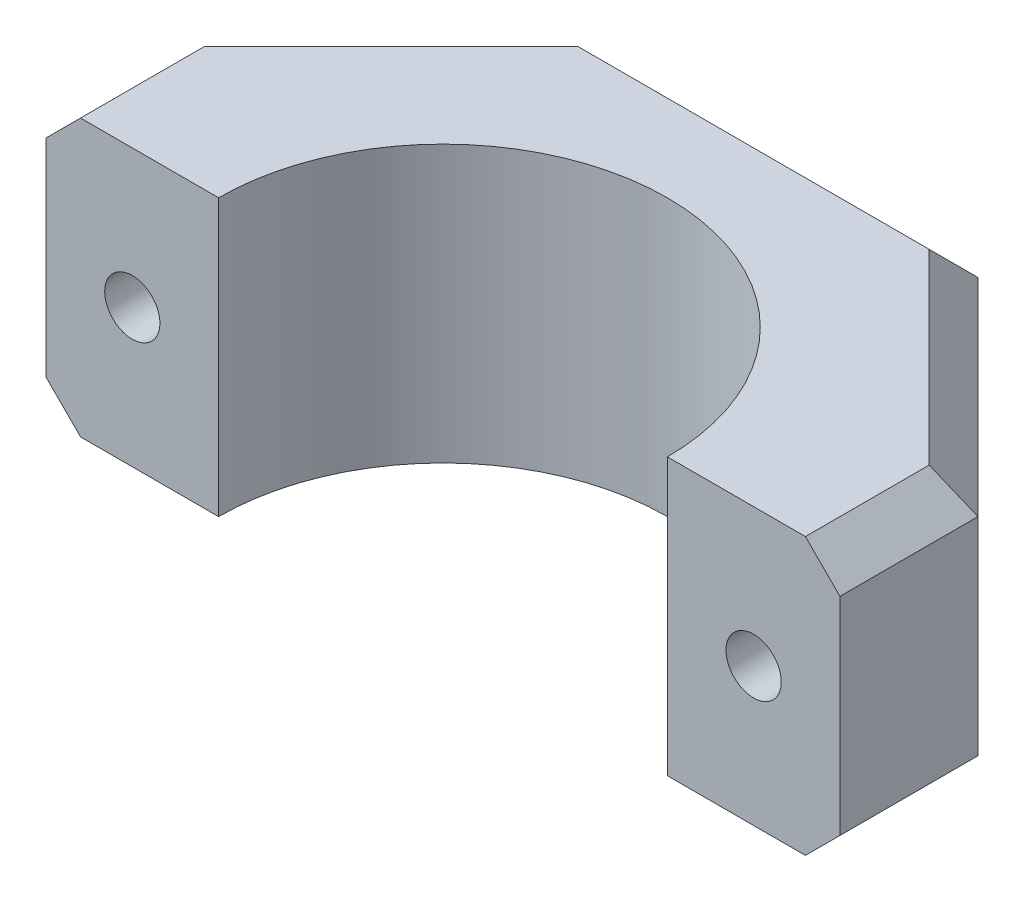
ISO-10303-21;
HEADER;
FILE_DESCRIPTION(('STEP AP214'),'2;1');
FILE_NAME('part.step','',(''),(''),'','','');
FILE_SCHEMA(('AUTOMOTIVE_DESIGN { 1 0 10303 214 1 1 1 1 }'));
ENDSEC;
DATA;
#1=APPLICATION_CONTEXT('core data for automotive mechanical design processes');
#2=APPLICATION_PROTOCOL_DEFINITION('international standard','automotive_design',2000,#1);
#3=PRODUCT_CONTEXT('',#1,'mechanical');
#4=PRODUCT('Part','Part','',(#3));
#5=PRODUCT_RELATED_PRODUCT_CATEGORY('part','',(#4));
#6=PRODUCT_DEFINITION_FORMATION('','',#4);
#7=PRODUCT_DEFINITION_CONTEXT('part definition',#1,'design');
#8=PRODUCT_DEFINITION('design','',#6,#7);
#9=PRODUCT_DEFINITION_SHAPE('','',#8);
#10=(LENGTH_UNIT() NAMED_UNIT(*) SI_UNIT(.MILLI.,.METRE.));
#11=(NAMED_UNIT(*) PLANE_ANGLE_UNIT() SI_UNIT($,.RADIAN.));
#12=(NAMED_UNIT(*) SI_UNIT($,.STERADIAN.) SOLID_ANGLE_UNIT());
#13=UNCERTAINTY_MEASURE_WITH_UNIT(LENGTH_MEASURE(1.E-05),#10,'distance_accuracy_value','');
#14=(GEOMETRIC_REPRESENTATION_CONTEXT(3) GLOBAL_UNCERTAINTY_ASSIGNED_CONTEXT((#13)) GLOBAL_UNIT_ASSIGNED_CONTEXT((#10,
#11,#12)) REPRESENTATION_CONTEXT('',''));
#15=CARTESIAN_POINT('',(0.,0.,0.));
#16=DIRECTION('',(0.,0.,1.));
#17=DIRECTION('',(1.,0.,0.));
#18=AXIS2_PLACEMENT_3D('',#15,#16,#17);
#19=CARTESIAN_POINT('',(-39.485549132948,8.,6.55438513369794));
#20=DIRECTION('',(0.,0.,-1.));
#21=DIRECTION('',(-1.,0.,0.));
#22=AXIS2_PLACEMENT_3D('',#19,#20,#21);
#23=CYLINDRICAL_SURFACE('',#22,1.6);
#24=CARTESIAN_POINT('',(-39.485549132948,8.,2.02890173410404));
#25=DIRECTION('',(0.,0.,-1.));
#26=DIRECTION('',(-1.,0.,0.));
#27=AXIS2_PLACEMENT_3D('',#24,#25,#26);
#28=CIRCLE('',#27,1.6);
#29=CARTESIAN_POINT('',(-41.085549132948,8.,2.02890173410404));
#30=VERTEX_POINT('',#29);
#31=EDGE_CURVE('E274',#30,#30,#28,.F.);
#32=CARTESIAN_POINT('',(-39.485549132948,8.,-1.97109826589596));
#33=DIRECTION('',(0.,0.,-1.));
#34=DIRECTION('',(-1.,0.,0.));
#35=AXIS2_PLACEMENT_3D('',#32,#33,#34);
#36=CIRCLE('',#35,1.6);
#37=CARTESIAN_POINT('',(-41.085549132948,8.,-1.97109826589596));
#38=VERTEX_POINT('',#37);
#39=EDGE_CURVE('E191',#38,#38,#36,.F.);
#40=CARTESIAN_POINT('',(-41.085549132948,8.,2.02890173410404));
#41=CARTESIAN_POINT('',(-41.085549132948,8.,1.98723506743738));
#42=CARTESIAN_POINT('',(-41.085549132948,8.,1.94556840077071));
#43=CARTESIAN_POINT('',(-41.085549132948,8.,1.86223506743738));
#44=CARTESIAN_POINT('',(-41.085549132948,8.,1.82056840077071));
#45=CARTESIAN_POINT('',(-41.085549132948,8.,1.73723506743738));
#46=CARTESIAN_POINT('',(-41.085549132948,8.,1.69556840077071));
#47=CARTESIAN_POINT('',(-41.085549132948,8.,1.61223506743737));
#48=CARTESIAN_POINT('',(-41.085549132948,8.,1.57056840077071));
#49=CARTESIAN_POINT('',(-41.085549132948,8.,1.48723506743738));
#50=CARTESIAN_POINT('',(-41.085549132948,8.,1.44556840077071));
#51=CARTESIAN_POINT('',(-41.085549132948,8.,1.36223506743738));
#52=CARTESIAN_POINT('',(-41.085549132948,8.,1.32056840077071));
#53=CARTESIAN_POINT('',(-41.085549132948,8.,1.23723506743738));
#54=CARTESIAN_POINT('',(-41.085549132948,8.,1.19556840077071));
#55=CARTESIAN_POINT('',(-41.085549132948,8.,1.11223506743738));
#56=CARTESIAN_POINT('',(-41.085549132948,8.,1.07056840077071));
#57=CARTESIAN_POINT('',(-41.085549132948,8.,0.987235067437375));
#58=CARTESIAN_POINT('',(-41.085549132948,8.,0.945568400770709));
#59=CARTESIAN_POINT('',(-41.085549132948,8.,0.862235067437375));
#60=CARTESIAN_POINT('',(-41.085549132948,8.,0.820568400770708));
#61=CARTESIAN_POINT('',(-41.085549132948,8.,0.737235067437375));
#62=CARTESIAN_POINT('',(-41.085549132948,8.,0.695568400770709));
#63=CARTESIAN_POINT('',(-41.085549132948,8.,0.612235067437376));
#64=CARTESIAN_POINT('',(-41.085549132948,8.,0.570568400770709));
#65=CARTESIAN_POINT('',(-41.085549132948,8.,0.487235067437376));
#66=CARTESIAN_POINT('',(-41.085549132948,8.,0.445568400770709));
#67=CARTESIAN_POINT('',(-41.085549132948,8.,0.362235067437376));
#68=CARTESIAN_POINT('',(-41.085549132948,8.,0.320568400770709));
#69=CARTESIAN_POINT('',(-41.085549132948,8.,0.237235067437375));
#70=CARTESIAN_POINT('',(-41.085549132948,8.,0.195568400770709));
#71=CARTESIAN_POINT('',(-41.085549132948,8.,0.112235067437375));
#72=CARTESIAN_POINT('',(-41.085549132948,8.,0.0705684007707086));
#73=CARTESIAN_POINT('',(-41.085549132948,8.,-0.0127649325626248));
#74=CARTESIAN_POINT('',(-41.085549132948,8.,-0.0544315992292915));
#75=CARTESIAN_POINT('',(-41.085549132948,8.,-0.137764932562625));
#76=CARTESIAN_POINT('',(-41.085549132948,8.,-0.179431599229292));
#77=CARTESIAN_POINT('',(-41.085549132948,8.,-0.262764932562625));
#78=CARTESIAN_POINT('',(-41.085549132948,8.,-0.304431599229292));
#79=CARTESIAN_POINT('',(-41.085549132948,8.,-0.387764932562625));
#80=CARTESIAN_POINT('',(-41.085549132948,8.,-0.429431599229292));
#81=CARTESIAN_POINT('',(-41.085549132948,8.,-0.512764932562625));
#82=CARTESIAN_POINT('',(-41.085549132948,8.,-0.554431599229292));
#83=CARTESIAN_POINT('',(-41.085549132948,8.,-0.637764932562625));
#84=CARTESIAN_POINT('',(-41.085549132948,8.,-0.679431599229292));
#85=CARTESIAN_POINT('',(-41.085549132948,8.,-0.762764932562625));
#86=CARTESIAN_POINT('',(-41.085549132948,8.,-0.804431599229291));
#87=CARTESIAN_POINT('',(-41.085549132948,8.,-0.887764932562625));
#88=CARTESIAN_POINT('',(-41.085549132948,8.,-0.929431599229291));
#89=CARTESIAN_POINT('',(-41.085549132948,8.,-1.01276493256262));
#90=CARTESIAN_POINT('',(-41.085549132948,8.,-1.05443159922929));
#91=CARTESIAN_POINT('',(-41.085549132948,8.,-1.13776493256262));
#92=CARTESIAN_POINT('',(-41.085549132948,8.,-1.17943159922929));
#93=CARTESIAN_POINT('',(-41.085549132948,8.,-1.26276493256262));
#94=CARTESIAN_POINT('',(-41.085549132948,8.,-1.30443159922929));
#95=CARTESIAN_POINT('',(-41.085549132948,8.,-1.38776493256262));
#96=CARTESIAN_POINT('',(-41.085549132948,8.,-1.42943159922929));
#97=CARTESIAN_POINT('',(-41.085549132948,8.,-1.51276493256262));
#98=CARTESIAN_POINT('',(-41.085549132948,8.,-1.55443159922929));
#99=CARTESIAN_POINT('',(-41.085549132948,8.,-1.63776493256262));
#100=CARTESIAN_POINT('',(-41.085549132948,8.,-1.67943159922929));
#101=CARTESIAN_POINT('',(-41.085549132948,8.,-1.76276493256262));
#102=CARTESIAN_POINT('',(-41.085549132948,8.,-1.80443159922929));
#103=CARTESIAN_POINT('',(-41.085549132948,8.,-1.88776493256262));
#104=CARTESIAN_POINT('',(-41.085549132948,8.,-1.92943159922929));
#105=CARTESIAN_POINT('',(-41.085549132948,8.,-1.97109826589596));
#106=B_SPLINE_CURVE_WITH_KNOTS('',3,(#40,#41,#42,#43,#44,#45,#46,#47,#48,#49,#50,#51,#52,#53,
#54,#55,#56,#57,#58,#59,#60,#61,#62,#63,#64,#65,#66,#67,#68,#69,#70,#71,#72,#73,#74,#75,#76,#77,
#78,#79,#80,#81,#82,#83,#84,#85,#86,#87,#88,#89,#90,#91,#92,#93,#94,#95,#96,#97,#98,#99,#100,
#101,#102,#103,#104,#105),.UNSPECIFIED.,.F.,.F.,(4,2,2,2,2,2,2,2,2,2,2,2,2,2,2,2,2,2,2,2,2,2,2,
2,2,2,2,2,2,2,2,2,4),(0.,0.125,0.25,0.375,0.5,0.625,0.75,0.875,1.,1.125,1.25,1.375,1.5,1.625,
1.75,1.875,2.,2.125,2.25,2.375,2.5,2.625,2.75,2.875,3.,3.125,3.25,3.375,3.5,3.625,3.75,3.875,
4.),.UNSPECIFIED.);
#107=EDGE_CURVE('BSEAM36',#30,#38,#106,.T.);
#108=ORIENTED_EDGE('',*,*,#31,.T.);
#109=ORIENTED_EDGE('',*,*,#39,.F.);
#110=ORIENTED_EDGE('',*,*,#107,.T.);
#111=ORIENTED_EDGE('',*,*,#107,.F.);
#112=EDGE_LOOP('',(#108,#110,#109,#111));
#113=FACE_BOUND('',#112,.T.);
#114=ADVANCED_FACE('F36',(#113),#23,.F.);
#115=CARTESIAN_POINT('',(-3.48554913294797,8.,6.55438513369794));
#116=DIRECTION('',(0.,0.,-1.));
#117=DIRECTION('',(-1.,0.,0.));
#118=AXIS2_PLACEMENT_3D('',#115,#116,#117);
#119=CYLINDRICAL_SURFACE('',#118,1.6);
#120=CARTESIAN_POINT('',(-3.48554913294797,8.,2.02890173410403));
#121=DIRECTION('',(0.,0.,-1.));
#122=DIRECTION('',(-1.,0.,0.));
#123=AXIS2_PLACEMENT_3D('',#120,#121,#122);
#124=CIRCLE('',#123,1.6);
#125=CARTESIAN_POINT('',(-5.08554913294797,8.,2.02890173410404));
#126=VERTEX_POINT('',#125);
#127=EDGE_CURVE('E185',#126,#126,#124,.F.);
#128=CARTESIAN_POINT('',(-3.48554913294797,8.,-1.97109826589597));
#129=DIRECTION('',(0.,0.,-1.));
#130=DIRECTION('',(-1.,0.,0.));
#131=AXIS2_PLACEMENT_3D('',#128,#129,#130);
#132=CIRCLE('',#131,1.6);
#133=CARTESIAN_POINT('',(-5.08554913294797,8.,-1.97109826589596));
#134=VERTEX_POINT('',#133);
#135=EDGE_CURVE('E186',#134,#134,#132,.F.);
#136=CARTESIAN_POINT('',(-5.08554913294797,8.,2.02890173410404));
#137=CARTESIAN_POINT('',(-5.08554913294797,8.,1.98723506743737));
#138=CARTESIAN_POINT('',(-5.08554913294797,8.,1.9455684007707));
#139=CARTESIAN_POINT('',(-5.08554913294797,8.,1.86223506743737));
#140=CARTESIAN_POINT('',(-5.08554913294797,8.,1.8205684007707));
#141=CARTESIAN_POINT('',(-5.08554913294797,8.,1.73723506743737));
#142=CARTESIAN_POINT('',(-5.08554913294797,8.,1.6955684007707));
#143=CARTESIAN_POINT('',(-5.08554913294797,8.,1.61223506743737));
#144=CARTESIAN_POINT('',(-5.08554913294797,8.,1.5705684007707));
#145=CARTESIAN_POINT('',(-5.08554913294797,8.,1.48723506743737));
#146=CARTESIAN_POINT('',(-5.08554913294797,8.,1.4455684007707));
#147=CARTESIAN_POINT('',(-5.08554913294797,8.,1.36223506743737));
#148=CARTESIAN_POINT('',(-5.08554913294797,8.,1.3205684007707));
#149=CARTESIAN_POINT('',(-5.08554913294797,8.,1.23723506743737));
#150=CARTESIAN_POINT('',(-5.08554913294797,8.,1.1955684007707));
#151=CARTESIAN_POINT('',(-5.08554913294797,8.,1.11223506743737));
#152=CARTESIAN_POINT('',(-5.08554913294797,8.,1.0705684007707));
#153=CARTESIAN_POINT('',(-5.08554913294797,8.,0.987235067437368));
#154=CARTESIAN_POINT('',(-5.08554913294797,8.,0.945568400770702));
#155=CARTESIAN_POINT('',(-5.08554913294797,8.,0.862235067437368));
#156=CARTESIAN_POINT('',(-5.08554913294797,8.,0.820568400770701));
#157=CARTESIAN_POINT('',(-5.08554913294797,8.,0.737235067437368));
#158=CARTESIAN_POINT('',(-5.08554913294797,8.,0.695568400770702));
#159=CARTESIAN_POINT('',(-5.08554913294797,8.,0.612235067437369));
#160=CARTESIAN_POINT('',(-5.08554913294797,8.,0.570568400770702));
#161=CARTESIAN_POINT('',(-5.08554913294797,8.,0.487235067437369));
#162=CARTESIAN_POINT('',(-5.08554913294797,8.,0.445568400770702));
#163=CARTESIAN_POINT('',(-5.08554913294797,8.,0.362235067437369));
#164=CARTESIAN_POINT('',(-5.08554913294797,8.,0.320568400770702));
#165=CARTESIAN_POINT('',(-5.08554913294797,8.,0.237235067437368));
#166=CARTESIAN_POINT('',(-5.08554913294797,8.,0.195568400770702));
#167=CARTESIAN_POINT('',(-5.08554913294797,8.,0.112235067437368));
#168=CARTESIAN_POINT('',(-5.08554913294797,8.,0.0705684007707017));
#169=CARTESIAN_POINT('',(-5.08554913294797,8.,-0.0127649325626318));
#170=CARTESIAN_POINT('',(-5.08554913294797,8.,-0.0544315992292985));
#171=CARTESIAN_POINT('',(-5.08554913294797,8.,-0.137764932562632));
#172=CARTESIAN_POINT('',(-5.08554913294797,8.,-0.179431599229299));
#173=CARTESIAN_POINT('',(-5.08554913294797,8.,-0.262764932562632));
#174=CARTESIAN_POINT('',(-5.08554913294797,8.,-0.304431599229299));
#175=CARTESIAN_POINT('',(-5.08554913294797,8.,-0.387764932562632));
#176=CARTESIAN_POINT('',(-5.08554913294797,8.,-0.429431599229299));
#177=CARTESIAN_POINT('',(-5.08554913294797,8.,-0.512764932562632));
#178=CARTESIAN_POINT('',(-5.08554913294797,8.,-0.554431599229299));
#179=CARTESIAN_POINT('',(-5.08554913294797,8.,-0.637764932562632));
#180=CARTESIAN_POINT('',(-5.08554913294797,8.,-0.679431599229298));
#181=CARTESIAN_POINT('',(-5.08554913294797,8.,-0.762764932562632));
#182=CARTESIAN_POINT('',(-5.08554913294797,8.,-0.804431599229298));
#183=CARTESIAN_POINT('',(-5.08554913294797,8.,-0.887764932562632));
#184=CARTESIAN_POINT('',(-5.08554913294797,8.,-0.929431599229298));
#185=CARTESIAN_POINT('',(-5.08554913294797,8.,-1.01276493256263));
#186=CARTESIAN_POINT('',(-5.08554913294797,8.,-1.0544315992293));
#187=CARTESIAN_POINT('',(-5.08554913294797,8.,-1.13776493256263));
#188=CARTESIAN_POINT('',(-5.08554913294797,8.,-1.1794315992293));
#189=CARTESIAN_POINT('',(-5.08554913294797,8.,-1.26276493256263));
#190=CARTESIAN_POINT('',(-5.08554913294797,8.,-1.3044315992293));
#191=CARTESIAN_POINT('',(-5.08554913294797,8.,-1.38776493256263));
#192=CARTESIAN_POINT('',(-5.08554913294797,8.,-1.4294315992293));
#193=CARTESIAN_POINT('',(-5.08554913294797,8.,-1.51276493256263));
#194=CARTESIAN_POINT('',(-5.08554913294797,8.,-1.5544315992293));
#195=CARTESIAN_POINT('',(-5.08554913294797,8.,-1.63776493256263));
#196=CARTESIAN_POINT('',(-5.08554913294797,8.,-1.6794315992293));
#197=CARTESIAN_POINT('',(-5.08554913294797,8.,-1.76276493256263));
#198=CARTESIAN_POINT('',(-5.08554913294797,8.,-1.8044315992293));
#199=CARTESIAN_POINT('',(-5.08554913294797,8.,-1.88776493256263));
#200=CARTESIAN_POINT('',(-5.08554913294797,8.,-1.9294315992293));
#201=CARTESIAN_POINT('',(-5.08554913294797,8.,-1.97109826589596));
#202=B_SPLINE_CURVE_WITH_KNOTS('',3,(#136,#137,#138,#139,#140,#141,#142,#143,#144,#145,#146,
#147,#148,#149,#150,#151,#152,#153,#154,#155,#156,#157,#158,#159,#160,#161,#162,#163,#164,#165,
#166,#167,#168,#169,#170,#171,#172,#173,#174,#175,#176,#177,#178,#179,#180,#181,#182,#183,#184,
#185,#186,#187,#188,#189,#190,#191,#192,#193,#194,#195,#196,#197,#198,#199,#200,#201),
.UNSPECIFIED.,.F.,.F.,(4,2,2,2,2,2,2,2,2,2,2,2,2,2,2,2,2,2,2,2,2,2,2,2,2,2,2,2,2,2,2,2,4),(0.,
0.125,0.25,0.375,0.5,0.625,0.75,0.875,1.,1.125,1.25,1.375,1.5,1.625,1.75,1.875,2.,2.125,2.25,
2.375,2.5,2.625,2.75,2.875,3.,3.125,3.25,3.375,3.5,3.625,3.75,3.875,4.),.UNSPECIFIED.);
#203=EDGE_CURVE('BSEAM341',#126,#134,#202,.T.);
#204=ORIENTED_EDGE('',*,*,#127,.T.);
#205=ORIENTED_EDGE('',*,*,#135,.F.);
#206=ORIENTED_EDGE('',*,*,#203,.T.);
#207=ORIENTED_EDGE('',*,*,#203,.F.);
#208=EDGE_LOOP('',(#204,#206,#205,#207));
#209=FACE_BOUND('',#208,.T.);
#210=ADVANCED_FACE('F341',(#209),#119,.F.);
#211=CARTESIAN_POINT('',(-21.485549132948,16.,2.02890173410404));
#212=DIRECTION('',(0.,-1.,0.));
#213=DIRECTION('',(0.,0.,-1.));
#214=AXIS2_PLACEMENT_3D('',#211,#212,#213);
#215=CYLINDRICAL_SURFACE('',#214,13.);
#216=CARTESIAN_POINT('',(-21.485549132948,0.,2.02890173410404));
#217=DIRECTION('',(0.,-1.,0.));
#218=DIRECTION('',(0.,0.,-1.));
#219=AXIS2_PLACEMENT_3D('',#216,#217,#218);
#220=CIRCLE('',#219,13.);
#221=CARTESIAN_POINT('',(-34.485549132948,0.,2.02890173410404));
#222=VERTEX_POINT('',#221);
#223=CARTESIAN_POINT('',(-8.48554913294797,0.,2.02890173410403));
#224=VERTEX_POINT('',#223);
#225=EDGE_CURVE('E161',#222,#224,#220,.T.);
#226=ORIENTED_EDGE('',*,*,#225,.T.);
#227=DIRECTION('',(0.,-1.,0.));
#228=VECTOR('',#227,1.);
#229=CARTESIAN_POINT('',(-8.48554913294797,16.,2.02890173410403));
#230=LINE('',#229,#228);
#231=CARTESIAN_POINT('',(-8.48554913294797,16.,2.02890173410403));
#232=VERTEX_POINT('',#231);
#233=EDGE_CURVE('E142',#232,#224,#230,.T.);
#234=ORIENTED_EDGE('',*,*,#233,.F.);
#235=CARTESIAN_POINT('',(-21.485549132948,16.,2.02890173410404));
#236=DIRECTION('',(0.,-1.,0.));
#237=DIRECTION('',(0.,0.,-1.));
#238=AXIS2_PLACEMENT_3D('',#235,#236,#237);
#239=CIRCLE('',#238,13.);
#240=CARTESIAN_POINT('',(-34.485549132948,16.,2.02890173410404));
#241=VERTEX_POINT('',#240);
#242=EDGE_CURVE('E149',#241,#232,#239,.T.);
#243=ORIENTED_EDGE('',*,*,#242,.F.);
#244=DIRECTION('',(0.,-1.,0.));
#245=VECTOR('',#244,1.);
#246=CARTESIAN_POINT('',(-34.485549132948,16.,2.02890173410404));
#247=LINE('',#246,#245);
#248=EDGE_CURVE('E268',#241,#222,#247,.T.);
#249=ORIENTED_EDGE('',*,*,#248,.T.);
#250=EDGE_LOOP('',(#226,#234,#243,#249));
#251=FACE_BOUND('',#250,.T.);
#252=ADVANCED_FACE('F159',(#251),#215,.F.);
#253=CARTESIAN_POINT('',(1.51445086705203,16.,2.02890173410403));
#254=DIRECTION('',(0.,0.,-1.));
#255=DIRECTION('',(-1.,0.,0.));
#256=AXIS2_PLACEMENT_3D('',#253,#254,#255);
#257=PLANE('',#256);
#258=ORIENTED_EDGE('',*,*,#127,.F.);
#259=EDGE_LOOP('',(#258));
#260=FACE_BOUND('',#259,.T.);
#261=DIRECTION('',(1.,0.,0.));
#262=VECTOR('',#261,1.);
#263=CARTESIAN_POINT('',(1.51445086705203,0.,2.02890173410403));
#264=LINE('',#263,#262);
#265=CARTESIAN_POINT('',(-0.485549132947971,0.,2.02890173410403));
#266=VERTEX_POINT('',#265);
#267=EDGE_CURVE('E273',#224,#266,#264,.T.);
#268=ORIENTED_EDGE('',*,*,#267,.T.);
#269=DIRECTION('',(0.707106781186546,0.707106781186549,0.));
#270=VECTOR('',#269,1.);
#271=CARTESIAN_POINT('',(1.51445086705203,2.00000000000001,2.02890173410403));
#272=LINE('',#271,#270);
#273=CARTESIAN_POINT('',(1.51445086705203,2.00000000000001,2.02890173410403));
#274=VERTEX_POINT('',#273);
#275=EDGE_CURVE('E219',#266,#274,#272,.T.);
#276=ORIENTED_EDGE('',*,*,#275,.T.);
#277=DIRECTION('',(0.,-1.,0.));
#278=VECTOR('',#277,1.);
#279=CARTESIAN_POINT('',(1.51445086705203,16.,2.02890173410403));
#280=LINE('',#279,#278);
#281=CARTESIAN_POINT('',(1.51445086705203,14.,2.02890173410403));
#282=VERTEX_POINT('',#281);
#283=EDGE_CURVE('E163',#282,#274,#280,.T.);
#284=ORIENTED_EDGE('',*,*,#283,.F.);
#285=DIRECTION('',(0.707106781186546,-0.707106781186549,0.));
#286=VECTOR('',#285,1.);
#287=CARTESIAN_POINT('',(-0.48554913294797,16.,2.02890173410403));
#288=LINE('',#287,#286);
#289=CARTESIAN_POINT('',(-0.48554913294797,16.,2.02890173410403));
#290=VERTEX_POINT('',#289);
#291=EDGE_CURVE('E146',#282,#290,#288,.F.);
#292=ORIENTED_EDGE('',*,*,#291,.T.);
#293=DIRECTION('',(1.,0.,0.));
#294=VECTOR('',#293,1.);
#295=CARTESIAN_POINT('',(1.51445086705203,16.,2.02890173410403));
#296=LINE('',#295,#294);
#297=EDGE_CURVE('E137',#232,#290,#296,.T.);
#298=ORIENTED_EDGE('',*,*,#297,.F.);
#299=ORIENTED_EDGE('',*,*,#233,.T.);
#300=EDGE_LOOP('',(#268,#276,#284,#292,#298,#299));
#301=FACE_BOUND('',#300,.T.);
#302=ADVANCED_FACE('F140',(#260,#301),#257,.F.);
#303=CARTESIAN_POINT('',(1.51445086705203,16.,-17.971098265896));
#304=DIRECTION('',(-1.,0.,0.));
#305=DIRECTION('',(0.,0.,1.));
#306=AXIS2_PLACEMENT_3D('',#303,#304,#305);
#307=PLANE('',#306);
#308=ORIENTED_EDGE('',*,*,#283,.T.);
#309=DIRECTION('',(0.,0.,-1.));
#310=VECTOR('',#309,1.);
#311=CARTESIAN_POINT('',(1.51445086705203,2.00000000000001,-5.97109826589591));
#312=LINE('',#311,#310);
#313=CARTESIAN_POINT('',(1.51445086705203,2.00000000000001,-5.97109826589591));
#314=VERTEX_POINT('',#313);
#315=EDGE_CURVE('E216',#274,#314,#312,.T.);
#316=ORIENTED_EDGE('',*,*,#315,.T.);
#317=DIRECTION('',(0.,1.,0.));
#318=VECTOR('',#317,1.);
#319=CARTESIAN_POINT('',(1.51445086705203,16.,-5.97109826589591));
#320=LINE('',#319,#318);
#321=CARTESIAN_POINT('',(1.51445086705203,14.,-5.97109826589591));
#322=VERTEX_POINT('',#321);
#323=EDGE_CURVE('E175',#314,#322,#320,.T.);
#324=ORIENTED_EDGE('',*,*,#323,.T.);
#325=DIRECTION('',(0.,0.,1.));
#326=VECTOR('',#325,1.);
#327=CARTESIAN_POINT('',(1.51445086705203,14.,-17.971098265896));
#328=LINE('',#327,#326);
#329=EDGE_CURVE('E214',#322,#282,#328,.T.);
#330=ORIENTED_EDGE('',*,*,#329,.T.);
#331=EDGE_LOOP('',(#308,#316,#324,#330));
#332=FACE_BOUND('',#331,.T.);
#333=ADVANCED_FACE('F308',(#332),#307,.F.);
#334=CARTESIAN_POINT('',(-44.485549132948,16.,-17.971098265896));
#335=DIRECTION('',(0.,0.,1.));
#336=DIRECTION('',(1.,0.,0.));
#337=AXIS2_PLACEMENT_3D('',#334,#335,#336);
#338=PLANE('',#337);
#339=DIRECTION('',(0.,-1.,0.));
#340=VECTOR('',#339,1.);
#341=CARTESIAN_POINT('',(-10.485549132948,16.,-17.971098265896));
#342=LINE('',#341,#340);
#343=CARTESIAN_POINT('',(-10.485549132948,14.,-17.971098265896));
#344=VERTEX_POINT('',#343);
#345=CARTESIAN_POINT('',(-10.485549132948,2.00000000000001,-17.971098265896));
#346=VERTEX_POINT('',#345);
#347=EDGE_CURVE('E166',#344,#346,#342,.T.);
#348=ORIENTED_EDGE('',*,*,#347,.T.);
#349=DIRECTION('',(-1.,0.,0.));
#350=VECTOR('',#349,1.);
#351=CARTESIAN_POINT('',(-32.4855491329479,2.00000000000001,-17.971098265896));
#352=LINE('',#351,#350);
#353=CARTESIAN_POINT('',(-32.4855491329479,2.00000000000001,-17.971098265896));
#354=VERTEX_POINT('',#353);
#355=EDGE_CURVE('E223',#346,#354,#352,.T.);
#356=ORIENTED_EDGE('',*,*,#355,.T.);
#357=DIRECTION('',(0.,1.,0.));
#358=VECTOR('',#357,1.);
#359=CARTESIAN_POINT('',(-32.4855491329479,16.,-17.971098265896));
#360=LINE('',#359,#358);
#361=CARTESIAN_POINT('',(-32.4855491329479,14.,-17.971098265896));
#362=VERTEX_POINT('',#361);
#363=EDGE_CURVE('E162',#354,#362,#360,.T.);
#364=ORIENTED_EDGE('',*,*,#363,.T.);
#365=DIRECTION('',(1.,0.,0.));
#366=VECTOR('',#365,1.);
#367=CARTESIAN_POINT('',(-44.485549132948,14.,-17.971098265896));
#368=LINE('',#367,#366);
#369=EDGE_CURVE('E221',#362,#344,#368,.T.);
#370=ORIENTED_EDGE('',*,*,#369,.T.);
#371=EDGE_LOOP('',(#348,#356,#364,#370));
#372=FACE_BOUND('',#371,.T.);
#373=ADVANCED_FACE('F322',(#372),#338,.F.);
#374=CARTESIAN_POINT('',(-44.485549132948,16.,2.02890173410404));
#375=DIRECTION('',(1.,0.,0.));
#376=DIRECTION('',(0.,0.,-1.));
#377=AXIS2_PLACEMENT_3D('',#374,#375,#376);
#378=PLANE('',#377);
#379=DIRECTION('',(0.,-1.,0.));
#380=VECTOR('',#379,1.);
#381=CARTESIAN_POINT('',(-44.485549132948,16.,-5.97109826589591));
#382=LINE('',#381,#380);
#383=CARTESIAN_POINT('',(-44.485549132948,14.,-5.97109826589591));
#384=VERTEX_POINT('',#383);
#385=CARTESIAN_POINT('',(-44.485549132948,2.00000000000001,-5.97109826589591));
#386=VERTEX_POINT('',#385);
#387=EDGE_CURVE('E178',#384,#386,#382,.T.);
#388=ORIENTED_EDGE('',*,*,#387,.T.);
#389=DIRECTION('',(0.,0.,1.));
#390=VECTOR('',#389,1.);
#391=CARTESIAN_POINT('',(-44.485549132948,2.00000000000001,2.02890173410404));
#392=LINE('',#391,#390);
#393=CARTESIAN_POINT('',(-44.485549132948,2.00000000000001,2.02890173410404));
#394=VERTEX_POINT('',#393);
#395=EDGE_CURVE('E193',#386,#394,#392,.T.);
#396=ORIENTED_EDGE('',*,*,#395,.T.);
#397=DIRECTION('',(0.,-1.,0.));
#398=VECTOR('',#397,1.);
#399=CARTESIAN_POINT('',(-44.485549132948,16.,2.02890173410404));
#400=LINE('',#399,#398);
#401=CARTESIAN_POINT('',(-44.485549132948,14.,2.02890173410404));
#402=VERTEX_POINT('',#401);
#403=EDGE_CURVE('E169',#402,#394,#400,.T.);
#404=ORIENTED_EDGE('',*,*,#403,.F.);
#405=DIRECTION('',(0.,0.,-1.));
#406=VECTOR('',#405,1.);
#407=CARTESIAN_POINT('',(-44.485549132948,14.,2.02890173410404));
#408=LINE('',#407,#406);
#409=EDGE_CURVE('E181',#402,#384,#408,.T.);
#410=ORIENTED_EDGE('',*,*,#409,.T.);
#411=EDGE_LOOP('',(#388,#396,#404,#410));
#412=FACE_BOUND('',#411,.T.);
#413=ADVANCED_FACE('F278',(#412),#378,.F.);
#414=CARTESIAN_POINT('',(-34.485549132948,16.,2.02890173410404));
#415=DIRECTION('',(0.,0.,-1.));
#416=DIRECTION('',(-1.,0.,0.));
#417=AXIS2_PLACEMENT_3D('',#414,#415,#416);
#418=PLANE('',#417);
#419=ORIENTED_EDGE('',*,*,#31,.F.);
#420=EDGE_LOOP('',(#419));
#421=FACE_BOUND('',#420,.T.);
#422=ORIENTED_EDGE('',*,*,#403,.T.);
#423=DIRECTION('',(0.707106781186545,-0.70710678118655,0.));
#424=VECTOR('',#423,1.);
#425=CARTESIAN_POINT('',(-44.485549132948,2.00000000000001,2.02890173410404));
#426=LINE('',#425,#424);
#427=CARTESIAN_POINT('',(-42.485549132948,0.,2.02890173410404));
#428=VERTEX_POINT('',#427);
#429=EDGE_CURVE('E198',#394,#428,#426,.T.);
#430=ORIENTED_EDGE('',*,*,#429,.T.);
#431=DIRECTION('',(1.,0.,0.));
#432=VECTOR('',#431,1.);
#433=CARTESIAN_POINT('',(-34.485549132948,0.,2.02890173410404));
#434=LINE('',#433,#432);
#435=EDGE_CURVE('E157',#428,#222,#434,.T.);
#436=ORIENTED_EDGE('',*,*,#435,.T.);
#437=ORIENTED_EDGE('',*,*,#248,.F.);
#438=DIRECTION('',(1.,0.,0.));
#439=VECTOR('',#438,1.);
#440=CARTESIAN_POINT('',(-34.485549132948,16.,2.02890173410404));
#441=LINE('',#440,#439);
#442=CARTESIAN_POINT('',(-42.485549132948,16.,2.02890173410404));
#443=VERTEX_POINT('',#442);
#444=EDGE_CURVE('E148',#443,#241,#441,.T.);
#445=ORIENTED_EDGE('',*,*,#444,.F.);
#446=DIRECTION('',(0.707106781186545,0.70710678118655,0.));
#447=VECTOR('',#446,1.);
#448=CARTESIAN_POINT('',(-42.485549132948,16.,2.02890173410404));
#449=LINE('',#448,#447);
#450=EDGE_CURVE('E196',#443,#402,#449,.F.);
#451=ORIENTED_EDGE('',*,*,#450,.T.);
#452=EDGE_LOOP('',(#422,#430,#436,#437,#445,#451));
#453=FACE_BOUND('',#452,.T.);
#454=ADVANCED_FACE('F266',(#421,#453),#418,.F.);
#455=CARTESIAN_POINT('',(-21.485549132948,16.,2.02890173410404));
#456=DIRECTION('',(0.,-1.,0.));
#457=DIRECTION('',(0.,0.,-1.));
#458=AXIS2_PLACEMENT_3D('',#455,#456,#457);
#459=PLANE('',#458);
#460=ORIENTED_EDGE('',*,*,#297,.T.);
#461=DIRECTION('',(0.,0.,-1.));
#462=VECTOR('',#461,1.);
#463=CARTESIAN_POINT('',(-0.48554913294797,16.,2.02890173410404));
#464=LINE('',#463,#462);
#465=CARTESIAN_POINT('',(-0.485549132947971,16.,-5.14267114114972));
#466=VERTEX_POINT('',#465);
#467=EDGE_CURVE('E13',#290,#466,#464,.T.);
#468=ORIENTED_EDGE('',*,*,#467,.T.);
#469=DIRECTION('',(-0.707106781186548,0.,-0.707106781186548));
#470=VECTOR('',#469,1.);
#471=CARTESIAN_POINT('',(-11.8997626953211,16.,-16.5568847035229));
#472=LINE('',#471,#470);
#473=CARTESIAN_POINT('',(-11.3139762576942,16.,-15.971098265896));
#474=VERTEX_POINT('',#473);
#475=EDGE_CURVE('E229',#466,#474,#472,.T.);
#476=ORIENTED_EDGE('',*,*,#475,.T.);
#477=DIRECTION('',(-1.,0.,0.));
#478=VECTOR('',#477,1.);
#479=CARTESIAN_POINT('',(-21.485549132948,16.,-15.971098265896));
#480=LINE('',#479,#478);
#481=CARTESIAN_POINT('',(-31.6571220082017,16.,-15.971098265896));
#482=VERTEX_POINT('',#481);
#483=EDGE_CURVE('E58',#474,#482,#480,.T.);
#484=ORIENTED_EDGE('',*,*,#483,.T.);
#485=DIRECTION('',(-0.707106781186548,0.,0.707106781186548));
#486=VECTOR('',#485,1.);
#487=CARTESIAN_POINT('',(-43.0713355705749,16.,-4.55688470352282));
#488=LINE('',#487,#486);
#489=CARTESIAN_POINT('',(-42.485549132948,16.,-5.14267114114972));
#490=VERTEX_POINT('',#489);
#491=EDGE_CURVE('E53',#482,#490,#488,.T.);
#492=ORIENTED_EDGE('',*,*,#491,.T.);
#493=DIRECTION('',(0.,0.,1.));
#494=VECTOR('',#493,1.);
#495=CARTESIAN_POINT('',(-42.485549132948,16.,2.02890173410404));
#496=LINE('',#495,#494);
#497=EDGE_CURVE('E45',#490,#443,#496,.T.);
#498=ORIENTED_EDGE('',*,*,#497,.T.);
#499=ORIENTED_EDGE('',*,*,#444,.T.);
#500=ORIENTED_EDGE('',*,*,#242,.T.);
#501=EDGE_LOOP('',(#460,#468,#476,#484,#492,#498,#499,#500));
#502=FACE_BOUND('',#501,.T.);
#503=ADVANCED_FACE('F152',(#502),#459,.F.);
#504=CARTESIAN_POINT('',(-21.485549132948,0.,2.02890173410404));
#505=DIRECTION('',(0.,-1.,0.));
#506=DIRECTION('',(0.,0.,-1.));
#507=AXIS2_PLACEMENT_3D('',#504,#505,#506);
#508=PLANE('',#507);
#509=ORIENTED_EDGE('',*,*,#435,.F.);
#510=DIRECTION('',(0.,0.,-1.));
#511=VECTOR('',#510,1.);
#512=CARTESIAN_POINT('',(-42.485549132948,0.,-5.97109826589591));
#513=LINE('',#512,#511);
#514=CARTESIAN_POINT('',(-42.485549132948,0.,-5.14267114114972));
#515=VERTEX_POINT('',#514);
#516=EDGE_CURVE('E208',#428,#515,#513,.T.);
#517=ORIENTED_EDGE('',*,*,#516,.T.);
#518=DIRECTION('',(0.707106781186548,0.,-0.707106781186548));
#519=VECTOR('',#518,1.);
#520=CARTESIAN_POINT('',(-35.5713355705749,0.,-12.0568847035228));
#521=LINE('',#520,#519);
#522=CARTESIAN_POINT('',(-31.6571220082017,0.,-15.971098265896));
#523=VERTEX_POINT('',#522);
#524=EDGE_CURVE('E206',#515,#523,#521,.T.);
#525=ORIENTED_EDGE('',*,*,#524,.T.);
#526=DIRECTION('',(1.,0.,0.));
#527=VECTOR('',#526,1.);
#528=CARTESIAN_POINT('',(-10.485549132948,0.,-15.971098265896));
#529=LINE('',#528,#527);
#530=CARTESIAN_POINT('',(-11.3139762576942,0.,-15.971098265896));
#531=VERTEX_POINT('',#530);
#532=EDGE_CURVE('E202',#523,#531,#529,.T.);
#533=ORIENTED_EDGE('',*,*,#532,.T.);
#534=DIRECTION('',(0.707106781186548,0.,0.707106781186548));
#535=VECTOR('',#534,1.);
#536=CARTESIAN_POINT('',(-7.39976269532109,0.,-12.0568847035228));
#537=LINE('',#536,#535);
#538=CARTESIAN_POINT('',(-0.485549132947971,0.,-5.14267114114972));
#539=VERTEX_POINT('',#538);
#540=EDGE_CURVE('E200',#531,#539,#537,.T.);
#541=ORIENTED_EDGE('',*,*,#540,.T.);
#542=DIRECTION('',(0.,0.,1.));
#543=VECTOR('',#542,1.);
#544=CARTESIAN_POINT('',(-0.485549132947971,0.,2.02890173410403));
#545=LINE('',#544,#543);
#546=EDGE_CURVE('E204',#539,#266,#545,.T.);
#547=ORIENTED_EDGE('',*,*,#546,.T.);
#548=ORIENTED_EDGE('',*,*,#267,.F.);
#549=ORIENTED_EDGE('',*,*,#225,.F.);
#550=EDGE_LOOP('',(#509,#517,#525,#533,#541,#547,#548,#549));
#551=FACE_BOUND('',#550,.T.);
#552=ADVANCED_FACE('F287',(#551),#508,.T.);
#553=CARTESIAN_POINT('',(-10.485549132948,16.,-17.971098265896));
#554=DIRECTION('',(-0.707106781186547,0.,0.707106781186547));
#555=DIRECTION('',(0.,-1.,0.));
#556=AXIS2_PLACEMENT_3D('',#553,#554,#555);
#557=PLANE('',#556);
#558=CARTESIAN_POINT('',(-3.48554913294797,8.,-10.9710982658959));
#559=DIRECTION('',(-0.707106781186547,0.,0.707106781186547));
#560=DIRECTION('',(-0.707106781186548,0.,-0.707106781186548));
#561=AXIS2_PLACEMENT_3D('',#558,#559,#560);
#562=ELLIPSE('',#561,4.24264068711929,3.);
#563=CARTESIAN_POINT('',(-6.48554913294797,8.,-13.9710982658959));
#564=VERTEX_POINT('',#563);
#565=EDGE_CURVE('E182',#564,#564,#562,.F.);
#566=ORIENTED_EDGE('',*,*,#565,.F.);
#567=EDGE_LOOP('',(#566));
#568=FACE_BOUND('',#567,.T.);
#569=ORIENTED_EDGE('',*,*,#323,.F.);
#570=DIRECTION('',(0.707106781186548,0.,0.707106781186548));
#571=VECTOR('',#570,1.);
#572=CARTESIAN_POINT('',(-10.485549132948,2.00000000000001,-17.971098265896));
#573=LINE('',#572,#571);
#574=EDGE_CURVE('E227',#314,#346,#573,.F.);
#575=ORIENTED_EDGE('',*,*,#574,.T.);
#576=ORIENTED_EDGE('',*,*,#347,.F.);
#577=DIRECTION('',(-0.707106781186548,0.,-0.707106781186548));
#578=VECTOR('',#577,1.);
#579=CARTESIAN_POINT('',(1.51445086705203,14.,-5.97109826589591));
#580=LINE('',#579,#578);
#581=EDGE_CURVE('E225',#344,#322,#580,.F.);
#582=ORIENTED_EDGE('',*,*,#581,.T.);
#583=EDGE_LOOP('',(#569,#575,#576,#582));
#584=FACE_BOUND('',#583,.T.);
#585=ADVANCED_FACE('F325',(#568,#584),#557,.F.);
#586=CARTESIAN_POINT('',(-44.485549132948,16.,-5.97109826589591));
#587=DIRECTION('',(0.707106781186547,0.,0.707106781186547));
#588=DIRECTION('',(0.,-1.,0.));
#589=AXIS2_PLACEMENT_3D('',#586,#587,#588);
#590=PLANE('',#589);
#591=CARTESIAN_POINT('',(-39.485549132948,8.,-10.9710982658959));
#592=DIRECTION('',(0.707106781186547,0.,0.707106781186547));
#593=DIRECTION('',(0.707106781186548,0.,-0.707106781186548));
#594=AXIS2_PLACEMENT_3D('',#591,#592,#593);
#595=ELLIPSE('',#594,4.24264068711929,3.);
#596=CARTESIAN_POINT('',(-36.485549132948,8.,-13.9710982658959));
#597=VERTEX_POINT('',#596);
#598=EDGE_CURVE('E187',#597,#597,#595,.F.);
#599=ORIENTED_EDGE('',*,*,#598,.F.);
#600=EDGE_LOOP('',(#599));
#601=FACE_BOUND('',#600,.T.);
#602=ORIENTED_EDGE('',*,*,#363,.F.);
#603=DIRECTION('',(0.707106781186548,0.,-0.707106781186548));
#604=VECTOR('',#603,1.);
#605=CARTESIAN_POINT('',(-44.485549132948,2.00000000000001,-5.97109826589591));
#606=LINE('',#605,#604);
#607=EDGE_CURVE('E212',#354,#386,#606,.F.);
#608=ORIENTED_EDGE('',*,*,#607,.T.);
#609=ORIENTED_EDGE('',*,*,#387,.F.);
#610=DIRECTION('',(-0.707106781186548,0.,0.707106781186548));
#611=VECTOR('',#610,1.);
#612=CARTESIAN_POINT('',(-32.4855491329479,14.,-17.971098265896));
#613=LINE('',#612,#611);
#614=EDGE_CURVE('E210',#384,#362,#613,.F.);
#615=ORIENTED_EDGE('',*,*,#614,.T.);
#616=EDGE_LOOP('',(#602,#608,#609,#615));
#617=FACE_BOUND('',#616,.T.);
#618=ADVANCED_FACE('F327',(#601,#617),#590,.F.);
#619=CARTESIAN_POINT('',(-3.48554913294797,8.,10.5141831083426));
#620=DIRECTION('',(0.,0.,-1.));
#621=DIRECTION('',(-1.,0.,0.));
#622=AXIS2_PLACEMENT_3D('',#619,#620,#621);
#623=CYLINDRICAL_SURFACE('',#622,3.);
#624=ORIENTED_EDGE('',*,*,#565,.T.);
#625=EDGE_LOOP('',(#624));
#626=FACE_BOUND('',#625,.T.);
#627=CARTESIAN_POINT('',(-3.48554913294797,8.,-1.97109826589597));
#628=DIRECTION('',(0.,0.,-1.));
#629=DIRECTION('',(-1.,0.,0.));
#630=AXIS2_PLACEMENT_3D('',#627,#628,#629);
#631=CIRCLE('',#630,3.);
#632=CARTESIAN_POINT('',(-6.48554913294797,8.,-1.97109826589597));
#633=VERTEX_POINT('',#632);
#634=EDGE_CURVE('E190',#633,#633,#631,.F.);
#635=ORIENTED_EDGE('',*,*,#634,.T.);
#636=EDGE_LOOP('',(#635));
#637=FACE_BOUND('',#636,.T.);
#638=ADVANCED_FACE('F334',(#626,#637),#623,.F.);
#639=CARTESIAN_POINT('',(-34.485549132948,16.,-1.97109826589596));
#640=DIRECTION('',(0.,0.,-1.));
#641=DIRECTION('',(-1.,0.,0.));
#642=AXIS2_PLACEMENT_3D('',#639,#640,#641);
#643=PLANE('',#642);
#644=ORIENTED_EDGE('',*,*,#634,.F.);
#645=EDGE_LOOP('',(#644));
#646=FACE_BOUND('',#645,.T.);
#647=ORIENTED_EDGE('',*,*,#135,.T.);
#648=EDGE_LOOP('',(#647));
#649=FACE_BOUND('',#648,.T.);
#650=ADVANCED_FACE('F506',(#646,#649),#643,.T.);
#651=CARTESIAN_POINT('',(-39.485549132948,8.,10.5141831083426));
#652=DIRECTION('',(0.,0.,-1.));
#653=DIRECTION('',(-1.,0.,0.));
#654=AXIS2_PLACEMENT_3D('',#651,#652,#653);
#655=CYLINDRICAL_SURFACE('',#654,3.);
#656=ORIENTED_EDGE('',*,*,#598,.T.);
#657=EDGE_LOOP('',(#656));
#658=FACE_BOUND('',#657,.T.);
#659=CARTESIAN_POINT('',(-39.485549132948,8.,-1.97109826589596));
#660=DIRECTION('',(0.,0.,-1.));
#661=DIRECTION('',(-1.,0.,0.));
#662=AXIS2_PLACEMENT_3D('',#659,#660,#661);
#663=CIRCLE('',#662,3.);
#664=CARTESIAN_POINT('',(-42.485549132948,8.,-1.97109826589596));
#665=VERTEX_POINT('',#664);
#666=EDGE_CURVE('E246',#665,#665,#663,.F.);
#667=ORIENTED_EDGE('',*,*,#666,.T.);
#668=EDGE_LOOP('',(#667));
#669=FACE_BOUND('',#668,.T.);
#670=ADVANCED_FACE('F499',(#658,#669),#655,.F.);
#671=CARTESIAN_POINT('',(-34.485549132948,16.,-1.97109826589596));
#672=DIRECTION('',(0.,0.,-1.));
#673=DIRECTION('',(-1.,0.,0.));
#674=AXIS2_PLACEMENT_3D('',#671,#672,#673);
#675=PLANE('',#674);
#676=ORIENTED_EDGE('',*,*,#666,.F.);
#677=EDGE_LOOP('',(#676));
#678=FACE_BOUND('',#677,.T.);
#679=ORIENTED_EDGE('',*,*,#39,.T.);
#680=EDGE_LOOP('',(#679));
#681=FACE_BOUND('',#680,.T.);
#682=ADVANCED_FACE('F421',(#678,#681),#675,.T.);
#683=CARTESIAN_POINT('',(1.51445086705203,2.00000000000001,-17.971098265896));
#684=DIRECTION('',(0.707106781186549,-0.707106781186546,0.));
#685=DIRECTION('',(0.,0.,1.));
#686=AXIS2_PLACEMENT_3D('',#683,#684,#685);
#687=PLANE('',#686);
#688=ORIENTED_EDGE('',*,*,#275,.F.);
#689=ORIENTED_EDGE('',*,*,#546,.F.);
#690=DIRECTION('',(-0.678598344545846,-0.678598344545849,0.281084637714819));
#691=VECTOR('',#690,1.);
#692=CARTESIAN_POINT('',(-2.35067306125306,-1.8651239283051,-4.37011151453917));
#693=LINE('',#692,#691);
#694=EDGE_CURVE('E243',#314,#539,#693,.T.);
#695=ORIENTED_EDGE('',*,*,#694,.F.);
#696=ORIENTED_EDGE('',*,*,#315,.F.);
#697=EDGE_LOOP('',(#688,#689,#695,#696));
#698=FACE_BOUND('',#697,.T.);
#699=ADVANCED_FACE('F306',(#698),#687,.T.);
#700=CARTESIAN_POINT('',(-7.39976269532109,0.,-12.0568847035228));
#701=DIRECTION('',(0.500000000000001,-0.707106781186545,-0.500000000000001));
#702=DIRECTION('',(-0.707106781186548,0.,-0.707106781186548));
#703=AXIS2_PLACEMENT_3D('',#700,#701,#702);
#704=PLANE('',#703);
#705=ORIENTED_EDGE('',*,*,#694,.T.);
#706=ORIENTED_EDGE('',*,*,#540,.F.);
#707=DIRECTION('',(0.281084637714819,0.678598344545849,-0.678598344545846));
#708=VECTOR('',#707,1.);
#709=CARTESIAN_POINT('',(-11.7513308954909,-1.05586749813564,-14.9152307677603));
#710=LINE('',#709,#708);
#711=EDGE_CURVE('E240',#346,#531,#710,.F.);
#712=ORIENTED_EDGE('',*,*,#711,.F.);
#713=ORIENTED_EDGE('',*,*,#574,.F.);
#714=EDGE_LOOP('',(#705,#706,#712,#713));
#715=FACE_BOUND('',#714,.T.);
#716=ADVANCED_FACE('F300',(#715),#704,.T.);
#717=CARTESIAN_POINT('',(-44.485549132948,2.00000000000001,-17.971098265896));
#718=DIRECTION('',(0.,-0.707106781186546,-0.707106781186549));
#719=DIRECTION('',(1.,0.,0.));
#720=AXIS2_PLACEMENT_3D('',#717,#718,#719);
#721=PLANE('',#720);
#722=ORIENTED_EDGE('',*,*,#711,.T.);
#723=ORIENTED_EDGE('',*,*,#532,.F.);
#724=DIRECTION('',(-0.281084637714819,0.678598344545849,-0.678598344545846));
#725=VECTOR('',#724,1.);
#726=CARTESIAN_POINT('',(-33.4336520156592,4.28892283796657,-20.2600211038625));
#727=LINE('',#726,#725);
#728=EDGE_CURVE('E237',#354,#523,#727,.F.);
#729=ORIENTED_EDGE('',*,*,#728,.F.);
#730=ORIENTED_EDGE('',*,*,#355,.F.);
#731=EDGE_LOOP('',(#722,#723,#729,#730));
#732=FACE_BOUND('',#731,.T.);
#733=ADVANCED_FACE('F295',(#732),#721,.T.);
#734=CARTESIAN_POINT('',(-35.5713355705749,0.,-12.0568847035228));
#735=DIRECTION('',(-0.500000000000002,-0.707106781186545,-0.500000000000002));
#736=DIRECTION('',(-0.707106781186548,0.,0.707106781186548));
#737=AXIS2_PLACEMENT_3D('',#734,#735,#736);
#738=PLANE('',#737);
#739=ORIENTED_EDGE('',*,*,#728,.T.);
#740=ORIENTED_EDGE('',*,*,#524,.F.);
#741=DIRECTION('',(-0.678598344545845,0.678598344545849,-0.28108463771482));
#742=VECTOR('',#741,1.);
#743=CARTESIAN_POINT('',(-40.6204252046429,-1.8651239283051,-4.37011151453917));
#744=LINE('',#743,#742);
#745=EDGE_CURVE('E234',#386,#515,#744,.F.);
#746=ORIENTED_EDGE('',*,*,#745,.F.);
#747=ORIENTED_EDGE('',*,*,#607,.F.);
#748=EDGE_LOOP('',(#739,#740,#746,#747));
#749=FACE_BOUND('',#748,.T.);
#750=ADVANCED_FACE('F290',(#749),#738,.T.);
#751=CARTESIAN_POINT('',(-44.485549132948,2.00000000000001,2.02890173410404));
#752=DIRECTION('',(-0.70710678118655,-0.707106781186545,0.));
#753=DIRECTION('',(0.,0.,-1.));
#754=AXIS2_PLACEMENT_3D('',#751,#752,#753);
#755=PLANE('',#754);
#756=ORIENTED_EDGE('',*,*,#745,.T.);
#757=ORIENTED_EDGE('',*,*,#516,.F.);
#758=ORIENTED_EDGE('',*,*,#429,.F.);
#759=ORIENTED_EDGE('',*,*,#395,.F.);
#760=EDGE_LOOP('',(#756,#757,#758,#759));
#761=FACE_BOUND('',#760,.T.);
#762=ADVANCED_FACE('F283',(#761),#755,.T.);
#763=CARTESIAN_POINT('',(-42.485549132948,16.,2.02890173410404));
#764=DIRECTION('',(0.70710678118655,-0.707106781186545,0.));
#765=DIRECTION('',(0.,0.,1.));
#766=AXIS2_PLACEMENT_3D('',#763,#764,#765);
#767=PLANE('',#766);
#768=ORIENTED_EDGE('',*,*,#450,.F.);
#769=ORIENTED_EDGE('',*,*,#497,.F.);
#770=DIRECTION('',(0.678598344545845,0.678598344545849,0.28108463771482));
#771=VECTOR('',#770,1.);
#772=CARTESIAN_POINT('',(-40.6204252046429,17.8651239283051,-4.37011151453917));
#773=LINE('',#772,#771);
#774=EDGE_CURVE('E40',#384,#490,#773,.T.);
#775=ORIENTED_EDGE('',*,*,#774,.F.);
#776=ORIENTED_EDGE('',*,*,#409,.F.);
#777=EDGE_LOOP('',(#768,#769,#775,#776));
#778=FACE_BOUND('',#777,.T.);
#779=ADVANCED_FACE('F38',(#778),#767,.F.);
#780=CARTESIAN_POINT('',(-35.5713355705749,16.,-12.0568847035228));
#781=DIRECTION('',(0.500000000000002,-0.707106781186545,0.500000000000002));
#782=DIRECTION('',(-0.707106781186548,0.,0.707106781186548));
#783=AXIS2_PLACEMENT_3D('',#780,#781,#782);
#784=PLANE('',#783);
#785=ORIENTED_EDGE('',*,*,#774,.T.);
#786=ORIENTED_EDGE('',*,*,#491,.F.);
#787=DIRECTION('',(0.281084637714819,0.678598344545849,0.678598344545846));
#788=VECTOR('',#787,1.);
#789=CARTESIAN_POINT('',(-30.8534805444738,17.9401621210175,-14.0309361448785));
#790=LINE('',#789,#788);
#791=EDGE_CURVE('E251',#362,#482,#790,.T.);
#792=ORIENTED_EDGE('',*,*,#791,.F.);
#793=ORIENTED_EDGE('',*,*,#614,.F.);
#794=EDGE_LOOP('',(#785,#786,#792,#793));
#795=FACE_BOUND('',#794,.T.);
#796=ADVANCED_FACE('F260',(#795),#784,.F.);
#797=CARTESIAN_POINT('',(-21.485549132948,16.,-15.971098265896));
#798=DIRECTION('',(0.,-0.707106781186546,0.707106781186549));
#799=DIRECTION('',(-1.,0.,0.));
#800=AXIS2_PLACEMENT_3D('',#797,#798,#799);
#801=PLANE('',#800);
#802=ORIENTED_EDGE('',*,*,#791,.T.);
#803=ORIENTED_EDGE('',*,*,#483,.F.);
#804=DIRECTION('',(-0.281084637714819,0.678598344545849,0.678598344545846));
#805=VECTOR('',#804,1.);
#806=CARTESIAN_POINT('',(-11.7513308954909,17.0558674981356,-14.9152307677603));
#807=LINE('',#806,#805);
#808=EDGE_CURVE('E249',#344,#474,#807,.T.);
#809=ORIENTED_EDGE('',*,*,#808,.F.);
#810=ORIENTED_EDGE('',*,*,#369,.F.);
#811=EDGE_LOOP('',(#802,#803,#809,#810));
#812=FACE_BOUND('',#811,.T.);
#813=ADVANCED_FACE('F319',(#812),#801,.F.);
#814=CARTESIAN_POINT('',(-7.39976269532109,16.,-12.0568847035228));
#815=DIRECTION('',(-0.500000000000001,-0.707106781186545,0.500000000000001));
#816=DIRECTION('',(-0.707106781186548,0.,-0.707106781186548));
#817=AXIS2_PLACEMENT_3D('',#814,#815,#816);
#818=PLANE('',#817);
#819=ORIENTED_EDGE('',*,*,#808,.T.);
#820=ORIENTED_EDGE('',*,*,#475,.F.);
#821=DIRECTION('',(0.678598344545846,-0.678598344545849,-0.281084637714819));
#822=VECTOR('',#821,1.);
#823=CARTESIAN_POINT('',(-2.35067306125306,17.8651239283051,-4.37011151453917));
#824=LINE('',#823,#822);
#825=EDGE_CURVE('E247',#322,#466,#824,.F.);
#826=ORIENTED_EDGE('',*,*,#825,.F.);
#827=ORIENTED_EDGE('',*,*,#581,.F.);
#828=EDGE_LOOP('',(#819,#820,#826,#827));
#829=FACE_BOUND('',#828,.T.);
#830=ADVANCED_FACE('F317',(#829),#818,.F.);
#831=CARTESIAN_POINT('',(-0.48554913294797,16.,2.02890173410404));
#832=DIRECTION('',(-0.707106781186549,-0.707106781186546,0.));
#833=DIRECTION('',(0.,0.,-1.));
#834=AXIS2_PLACEMENT_3D('',#831,#832,#833);
#835=PLANE('',#834);
#836=ORIENTED_EDGE('',*,*,#291,.F.);
#837=ORIENTED_EDGE('',*,*,#329,.F.);
#838=ORIENTED_EDGE('',*,*,#825,.T.);
#839=ORIENTED_EDGE('',*,*,#467,.F.);
#840=EDGE_LOOP('',(#836,#837,#838,#839));
#841=FACE_BOUND('',#840,.T.);
#842=ADVANCED_FACE('F313',(#841),#835,.F.);
#843=CLOSED_SHELL('',(#114,#210,#252,#302,#333,#373,#413,#454,#503,#552,#585,#618,#638,#650,
#670,#682,#699,#716,#733,#750,#762,#779,#796,#813,#830,#842));
#844=MANIFOLD_SOLID_BREP('B2',#843);
#845=ADVANCED_BREP_SHAPE_REPRESENTATION('',(#18,#844),#14);
#846=SHAPE_DEFINITION_REPRESENTATION(#9,#845);
ENDSEC;
END-ISO-10303-21;
